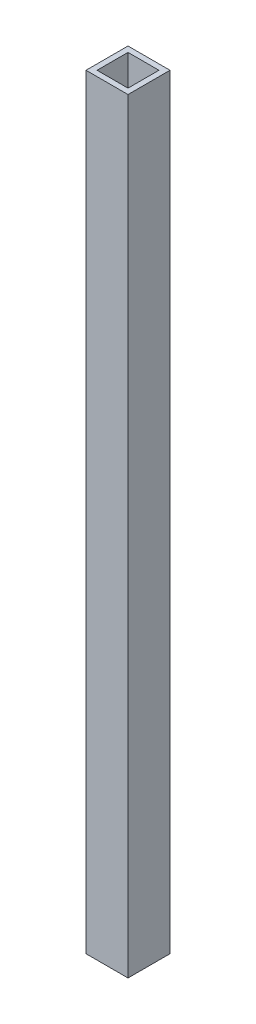
ISO-10303-21;
HEADER;
FILE_DESCRIPTION(('STEP AP214'),'2;1');
FILE_NAME('part.step','',(''),(''),'','','');
FILE_SCHEMA(('AUTOMOTIVE_DESIGN { 1 0 10303 214 1 1 1 1 }'));
ENDSEC;
DATA;
#1=APPLICATION_CONTEXT('core data for automotive mechanical design processes');
#2=APPLICATION_PROTOCOL_DEFINITION('international standard','automotive_design',2000,#1);
#3=PRODUCT_CONTEXT('',#1,'mechanical');
#4=PRODUCT('Part','Part','',(#3));
#5=PRODUCT_RELATED_PRODUCT_CATEGORY('part','',(#4));
#6=PRODUCT_DEFINITION_FORMATION('','',#4);
#7=PRODUCT_DEFINITION_CONTEXT('part definition',#1,'design');
#8=PRODUCT_DEFINITION('design','',#6,#7);
#9=PRODUCT_DEFINITION_SHAPE('','',#8);
#10=(LENGTH_UNIT() NAMED_UNIT(*) SI_UNIT(.MILLI.,.METRE.));
#11=(NAMED_UNIT(*) PLANE_ANGLE_UNIT() SI_UNIT($,.RADIAN.));
#12=(NAMED_UNIT(*) SI_UNIT($,.STERADIAN.) SOLID_ANGLE_UNIT());
#13=UNCERTAINTY_MEASURE_WITH_UNIT(LENGTH_MEASURE(1.E-05),#10,'distance_accuracy_value','');
#14=(GEOMETRIC_REPRESENTATION_CONTEXT(3) GLOBAL_UNCERTAINTY_ASSIGNED_CONTEXT((#13)) GLOBAL_UNIT_ASSIGNED_CONTEXT((#10,
#11,#12)) REPRESENTATION_CONTEXT('',''));
#15=CARTESIAN_POINT('',(0.,0.,0.));
#16=DIRECTION('',(0.,0.,1.));
#17=DIRECTION('',(1.,0.,0.));
#18=AXIS2_PLACEMENT_3D('',#15,#16,#17);
#19=CARTESIAN_POINT('',(0.,692.,0.));
#20=DIRECTION('',(0.,-1.,0.));
#21=DIRECTION('',(0.,0.,-1.));
#22=AXIS2_PLACEMENT_3D('',#19,#20,#21);
#23=PLANE('',#22);
#24=DIRECTION('',(0.,0.,1.));
#25=VECTOR('',#24,1.);
#26=CARTESIAN_POINT('',(0.,692.,0.));
#27=LINE('',#26,#25);
#28=CARTESIAN_POINT('',(0.,692.,-38.));
#29=VERTEX_POINT('',#28);
#30=CARTESIAN_POINT('',(0.,692.,0.));
#31=VERTEX_POINT('',#30);
#32=EDGE_CURVE('E135',#29,#31,#27,.T.);
#33=ORIENTED_EDGE('',*,*,#32,.T.);
#34=DIRECTION('',(1.,0.,0.));
#35=VECTOR('',#34,1.);
#36=CARTESIAN_POINT('',(0.,692.,0.));
#37=LINE('',#36,#35);
#38=CARTESIAN_POINT('',(38.,692.,0.));
#39=VERTEX_POINT('',#38);
#40=EDGE_CURVE('E138',#31,#39,#37,.T.);
#41=ORIENTED_EDGE('',*,*,#40,.T.);
#42=DIRECTION('',(0.,0.,-1.));
#43=VECTOR('',#42,1.);
#44=CARTESIAN_POINT('',(38.,692.,0.));
#45=LINE('',#44,#43);
#46=CARTESIAN_POINT('',(38.,692.,-38.));
#47=VERTEX_POINT('',#46);
#48=EDGE_CURVE('E141',#39,#47,#45,.T.);
#49=ORIENTED_EDGE('',*,*,#48,.T.);
#50=DIRECTION('',(-1.,0.,0.));
#51=VECTOR('',#50,1.);
#52=CARTESIAN_POINT('',(0.,692.,-38.));
#53=LINE('',#52,#51);
#54=EDGE_CURVE('E143',#47,#29,#53,.T.);
#55=ORIENTED_EDGE('',*,*,#54,.T.);
#56=EDGE_LOOP('',(#33,#41,#49,#55));
#57=FACE_BOUND('',#56,.T.);
#58=DIRECTION('',(0.,0.,1.));
#59=VECTOR('',#58,1.);
#60=CARTESIAN_POINT('',(5.,692.,-5.));
#61=LINE('',#60,#59);
#62=CARTESIAN_POINT('',(5.,692.,-33.));
#63=VERTEX_POINT('',#62);
#64=CARTESIAN_POINT('',(5.,692.,-5.));
#65=VERTEX_POINT('',#64);
#66=EDGE_CURVE('E99',#63,#65,#61,.T.);
#67=ORIENTED_EDGE('',*,*,#66,.F.);
#68=DIRECTION('',(-1.,0.,0.));
#69=VECTOR('',#68,1.);
#70=CARTESIAN_POINT('',(5.,692.,-33.));
#71=LINE('',#70,#69);
#72=CARTESIAN_POINT('',(33.,692.,-33.));
#73=VERTEX_POINT('',#72);
#74=EDGE_CURVE('E121',#73,#63,#71,.T.);
#75=ORIENTED_EDGE('',*,*,#74,.F.);
#76=DIRECTION('',(0.,0.,-1.));
#77=VECTOR('',#76,1.);
#78=CARTESIAN_POINT('',(33.,692.,-5.));
#79=LINE('',#78,#77);
#80=CARTESIAN_POINT('',(33.,692.,-5.));
#81=VERTEX_POINT('',#80);
#82=EDGE_CURVE('E119',#81,#73,#79,.T.);
#83=ORIENTED_EDGE('',*,*,#82,.F.);
#84=DIRECTION('',(1.,0.,0.));
#85=VECTOR('',#84,1.);
#86=CARTESIAN_POINT('',(5.,692.,-5.));
#87=LINE('',#86,#85);
#88=EDGE_CURVE('E107',#65,#81,#87,.T.);
#89=ORIENTED_EDGE('',*,*,#88,.F.);
#90=EDGE_LOOP('',(#67,#75,#83,#89));
#91=FACE_BOUND('',#90,.T.);
#92=ADVANCED_FACE('F34',(#57,#91),#23,.F.);
#93=CARTESIAN_POINT('',(0.,0.,0.));
#94=DIRECTION('',(0.,-1.,0.));
#95=DIRECTION('',(0.,0.,-1.));
#96=AXIS2_PLACEMENT_3D('',#93,#94,#95);
#97=PLANE('',#96);
#98=DIRECTION('',(0.,0.,1.));
#99=VECTOR('',#98,1.);
#100=CARTESIAN_POINT('',(0.,0.,0.));
#101=LINE('',#100,#99);
#102=CARTESIAN_POINT('',(0.,0.,-38.));
#103=VERTEX_POINT('',#102);
#104=CARTESIAN_POINT('',(0.,0.,0.));
#105=VERTEX_POINT('',#104);
#106=EDGE_CURVE('E115',#103,#105,#101,.T.);
#107=ORIENTED_EDGE('',*,*,#106,.F.);
#108=DIRECTION('',(-1.,0.,0.));
#109=VECTOR('',#108,1.);
#110=CARTESIAN_POINT('',(0.,0.,-38.));
#111=LINE('',#110,#109);
#112=CARTESIAN_POINT('',(38.,0.,-38.));
#113=VERTEX_POINT('',#112);
#114=EDGE_CURVE('E139',#113,#103,#111,.T.);
#115=ORIENTED_EDGE('',*,*,#114,.F.);
#116=DIRECTION('',(0.,0.,-1.));
#117=VECTOR('',#116,1.);
#118=CARTESIAN_POINT('',(38.,0.,0.));
#119=LINE('',#118,#117);
#120=CARTESIAN_POINT('',(38.,0.,0.));
#121=VERTEX_POINT('',#120);
#122=EDGE_CURVE('E150',#121,#113,#119,.T.);
#123=ORIENTED_EDGE('',*,*,#122,.F.);
#124=DIRECTION('',(1.,0.,0.));
#125=VECTOR('',#124,1.);
#126=CARTESIAN_POINT('',(0.,0.,0.));
#127=LINE('',#126,#125);
#128=EDGE_CURVE('E148',#105,#121,#127,.T.);
#129=ORIENTED_EDGE('',*,*,#128,.F.);
#130=EDGE_LOOP('',(#107,#115,#123,#129));
#131=FACE_BOUND('',#130,.T.);
#132=DIRECTION('',(-1.,0.,0.));
#133=VECTOR('',#132,1.);
#134=CARTESIAN_POINT('',(5.,0.,-33.));
#135=LINE('',#134,#133);
#136=CARTESIAN_POINT('',(33.,0.,-33.));
#137=VERTEX_POINT('',#136);
#138=CARTESIAN_POINT('',(5.,0.,-33.));
#139=VERTEX_POINT('',#138);
#140=EDGE_CURVE('E108',#137,#139,#135,.T.);
#141=ORIENTED_EDGE('',*,*,#140,.T.);
#142=DIRECTION('',(0.,0.,1.));
#143=VECTOR('',#142,1.);
#144=CARTESIAN_POINT('',(5.,0.,-5.));
#145=LINE('',#144,#143);
#146=CARTESIAN_POINT('',(5.,0.,-5.));
#147=VERTEX_POINT('',#146);
#148=EDGE_CURVE('E57',#139,#147,#145,.T.);
#149=ORIENTED_EDGE('',*,*,#148,.T.);
#150=DIRECTION('',(1.,0.,0.));
#151=VECTOR('',#150,1.);
#152=CARTESIAN_POINT('',(5.,0.,-5.));
#153=LINE('',#152,#151);
#154=CARTESIAN_POINT('',(33.,0.,-5.));
#155=VERTEX_POINT('',#154);
#156=EDGE_CURVE('E114',#147,#155,#153,.T.);
#157=ORIENTED_EDGE('',*,*,#156,.T.);
#158=DIRECTION('',(0.,0.,-1.));
#159=VECTOR('',#158,1.);
#160=CARTESIAN_POINT('',(33.,0.,-5.));
#161=LINE('',#160,#159);
#162=EDGE_CURVE('E127',#155,#137,#161,.T.);
#163=ORIENTED_EDGE('',*,*,#162,.T.);
#164=EDGE_LOOP('',(#141,#149,#157,#163));
#165=FACE_BOUND('',#164,.T.);
#166=ADVANCED_FACE('F168',(#131,#165),#97,.T.);
#167=CARTESIAN_POINT('',(0.,692.,0.));
#168=DIRECTION('',(1.,0.,0.));
#169=DIRECTION('',(0.,0.,-1.));
#170=AXIS2_PLACEMENT_3D('',#167,#168,#169);
#171=PLANE('',#170);
#172=ORIENTED_EDGE('',*,*,#106,.T.);
#173=DIRECTION('',(0.,-1.,0.));
#174=VECTOR('',#173,1.);
#175=CARTESIAN_POINT('',(0.,692.,0.));
#176=LINE('',#175,#174);
#177=EDGE_CURVE('E11',#31,#105,#176,.T.);
#178=ORIENTED_EDGE('',*,*,#177,.F.);
#179=ORIENTED_EDGE('',*,*,#32,.F.);
#180=DIRECTION('',(0.,-1.,0.));
#181=VECTOR('',#180,1.);
#182=CARTESIAN_POINT('',(0.,692.,-38.));
#183=LINE('',#182,#181);
#184=EDGE_CURVE('E145',#29,#103,#183,.T.);
#185=ORIENTED_EDGE('',*,*,#184,.T.);
#186=EDGE_LOOP('',(#172,#178,#179,#185));
#187=FACE_BOUND('',#186,.T.);
#188=ADVANCED_FACE('F36',(#187),#171,.F.);
#189=CARTESIAN_POINT('',(0.,692.,0.));
#190=DIRECTION('',(0.,0.,-1.));
#191=DIRECTION('',(-1.,0.,0.));
#192=AXIS2_PLACEMENT_3D('',#189,#190,#191);
#193=PLANE('',#192);
#194=ORIENTED_EDGE('',*,*,#128,.T.);
#195=DIRECTION('',(0.,-1.,0.));
#196=VECTOR('',#195,1.);
#197=CARTESIAN_POINT('',(38.,692.,0.));
#198=LINE('',#197,#196);
#199=EDGE_CURVE('E42',#39,#121,#198,.T.);
#200=ORIENTED_EDGE('',*,*,#199,.F.);
#201=ORIENTED_EDGE('',*,*,#40,.F.);
#202=ORIENTED_EDGE('',*,*,#177,.T.);
#203=EDGE_LOOP('',(#194,#200,#201,#202));
#204=FACE_BOUND('',#203,.T.);
#205=ADVANCED_FACE('F178',(#204),#193,.F.);
#206=CARTESIAN_POINT('',(38.,692.,0.));
#207=DIRECTION('',(-1.,0.,0.));
#208=DIRECTION('',(0.,0.,1.));
#209=AXIS2_PLACEMENT_3D('',#206,#207,#208);
#210=PLANE('',#209);
#211=ORIENTED_EDGE('',*,*,#122,.T.);
#212=DIRECTION('',(0.,-1.,0.));
#213=VECTOR('',#212,1.);
#214=CARTESIAN_POINT('',(38.,692.,-38.));
#215=LINE('',#214,#213);
#216=EDGE_CURVE('E155',#47,#113,#215,.T.);
#217=ORIENTED_EDGE('',*,*,#216,.F.);
#218=ORIENTED_EDGE('',*,*,#48,.F.);
#219=ORIENTED_EDGE('',*,*,#199,.T.);
#220=EDGE_LOOP('',(#211,#217,#218,#219));
#221=FACE_BOUND('',#220,.T.);
#222=ADVANCED_FACE('F162',(#221),#210,.F.);
#223=CARTESIAN_POINT('',(0.,692.,-38.));
#224=DIRECTION('',(0.,0.,1.));
#225=DIRECTION('',(1.,0.,0.));
#226=AXIS2_PLACEMENT_3D('',#223,#224,#225);
#227=PLANE('',#226);
#228=ORIENTED_EDGE('',*,*,#114,.T.);
#229=ORIENTED_EDGE('',*,*,#184,.F.);
#230=ORIENTED_EDGE('',*,*,#54,.F.);
#231=ORIENTED_EDGE('',*,*,#216,.T.);
#232=EDGE_LOOP('',(#228,#229,#230,#231));
#233=FACE_BOUND('',#232,.T.);
#234=ADVANCED_FACE('F172',(#233),#227,.F.);
#235=CARTESIAN_POINT('',(5.,692.,-5.));
#236=DIRECTION('',(1.,0.,0.));
#237=DIRECTION('',(0.,0.,-1.));
#238=AXIS2_PLACEMENT_3D('',#235,#236,#237);
#239=PLANE('',#238);
#240=ORIENTED_EDGE('',*,*,#148,.F.);
#241=DIRECTION('',(0.,-1.,0.));
#242=VECTOR('',#241,1.);
#243=CARTESIAN_POINT('',(5.,692.,-33.));
#244=LINE('',#243,#242);
#245=EDGE_CURVE('E103',#63,#139,#244,.T.);
#246=ORIENTED_EDGE('',*,*,#245,.F.);
#247=ORIENTED_EDGE('',*,*,#66,.T.);
#248=DIRECTION('',(0.,-1.,0.));
#249=VECTOR('',#248,1.);
#250=CARTESIAN_POINT('',(5.,692.,-5.));
#251=LINE('',#250,#249);
#252=EDGE_CURVE('E102',#65,#147,#251,.T.);
#253=ORIENTED_EDGE('',*,*,#252,.T.);
#254=EDGE_LOOP('',(#240,#246,#247,#253));
#255=FACE_BOUND('',#254,.T.);
#256=ADVANCED_FACE('F101',(#255),#239,.T.);
#257=CARTESIAN_POINT('',(5.,692.,-5.));
#258=DIRECTION('',(0.,0.,-1.));
#259=DIRECTION('',(-1.,0.,0.));
#260=AXIS2_PLACEMENT_3D('',#257,#258,#259);
#261=PLANE('',#260);
#262=ORIENTED_EDGE('',*,*,#156,.F.);
#263=ORIENTED_EDGE('',*,*,#252,.F.);
#264=ORIENTED_EDGE('',*,*,#88,.T.);
#265=DIRECTION('',(0.,-1.,0.));
#266=VECTOR('',#265,1.);
#267=CARTESIAN_POINT('',(33.,692.,-5.));
#268=LINE('',#267,#266);
#269=EDGE_CURVE('E116',#81,#155,#268,.T.);
#270=ORIENTED_EDGE('',*,*,#269,.T.);
#271=EDGE_LOOP('',(#262,#263,#264,#270));
#272=FACE_BOUND('',#271,.T.);
#273=ADVANCED_FACE('F111',(#272),#261,.T.);
#274=CARTESIAN_POINT('',(33.,692.,-5.));
#275=DIRECTION('',(-1.,0.,0.));
#276=DIRECTION('',(0.,0.,1.));
#277=AXIS2_PLACEMENT_3D('',#274,#275,#276);
#278=PLANE('',#277);
#279=ORIENTED_EDGE('',*,*,#162,.F.);
#280=ORIENTED_EDGE('',*,*,#269,.F.);
#281=ORIENTED_EDGE('',*,*,#82,.T.);
#282=DIRECTION('',(0.,-1.,0.));
#283=VECTOR('',#282,1.);
#284=CARTESIAN_POINT('',(33.,692.,-33.));
#285=LINE('',#284,#283);
#286=EDGE_CURVE('E49',#73,#137,#285,.T.);
#287=ORIENTED_EDGE('',*,*,#286,.T.);
#288=EDGE_LOOP('',(#279,#280,#281,#287));
#289=FACE_BOUND('',#288,.T.);
#290=ADVANCED_FACE('F201',(#289),#278,.T.);
#291=CARTESIAN_POINT('',(5.,692.,-33.));
#292=DIRECTION('',(0.,0.,1.));
#293=DIRECTION('',(1.,0.,0.));
#294=AXIS2_PLACEMENT_3D('',#291,#292,#293);
#295=PLANE('',#294);
#296=ORIENTED_EDGE('',*,*,#140,.F.);
#297=ORIENTED_EDGE('',*,*,#286,.F.);
#298=ORIENTED_EDGE('',*,*,#74,.T.);
#299=ORIENTED_EDGE('',*,*,#245,.T.);
#300=EDGE_LOOP('',(#296,#297,#298,#299));
#301=FACE_BOUND('',#300,.T.);
#302=ADVANCED_FACE('F205',(#301),#295,.T.);
#303=CLOSED_SHELL('',(#92,#166,#188,#205,#222,#234,#256,#273,#290,#302));
#304=MANIFOLD_SOLID_BREP('B2',#303);
#305=ADVANCED_BREP_SHAPE_REPRESENTATION('',(#18,#304),#14);
#306=SHAPE_DEFINITION_REPRESENTATION(#9,#305);
ENDSEC;
END-ISO-10303-21;
